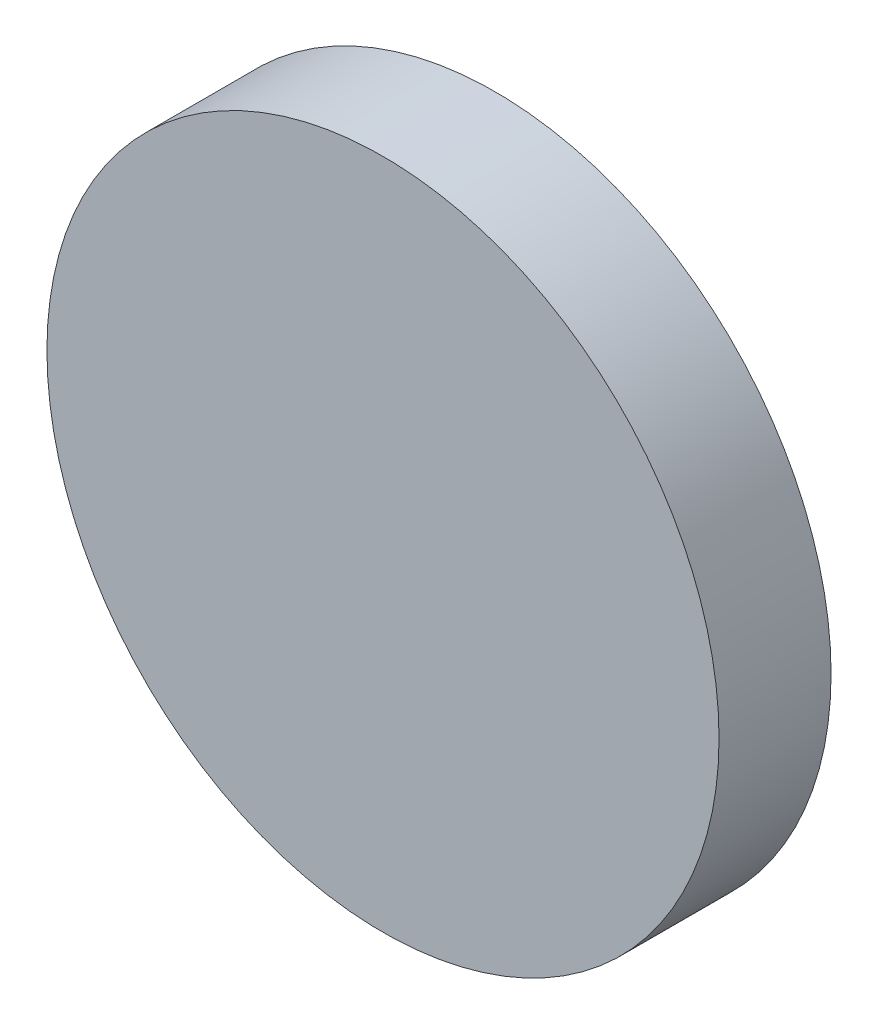
ISO-10303-21;
HEADER;
FILE_DESCRIPTION(('STEP AP214'),'2;1');
FILE_NAME('part.step','',(''),(''),'','','');
FILE_SCHEMA(('AUTOMOTIVE_DESIGN { 1 0 10303 214 1 1 1 1 }'));
ENDSEC;
DATA;
#1=APPLICATION_CONTEXT('core data for automotive mechanical design processes');
#2=APPLICATION_PROTOCOL_DEFINITION('international standard','automotive_design',2000,#1);
#3=PRODUCT_CONTEXT('',#1,'mechanical');
#4=PRODUCT('Part','Part','',(#3));
#5=PRODUCT_RELATED_PRODUCT_CATEGORY('part','',(#4));
#6=PRODUCT_DEFINITION_FORMATION('','',#4);
#7=PRODUCT_DEFINITION_CONTEXT('part definition',#1,'design');
#8=PRODUCT_DEFINITION('design','',#6,#7);
#9=PRODUCT_DEFINITION_SHAPE('','',#8);
#10=(LENGTH_UNIT() NAMED_UNIT(*) SI_UNIT(.MILLI.,.METRE.));
#11=(NAMED_UNIT(*) PLANE_ANGLE_UNIT() SI_UNIT($,.RADIAN.));
#12=(NAMED_UNIT(*) SI_UNIT($,.STERADIAN.) SOLID_ANGLE_UNIT());
#13=UNCERTAINTY_MEASURE_WITH_UNIT(LENGTH_MEASURE(1.E-05),#10,'distance_accuracy_value','');
#14=(GEOMETRIC_REPRESENTATION_CONTEXT(3) GLOBAL_UNCERTAINTY_ASSIGNED_CONTEXT((#13)) GLOBAL_UNIT_ASSIGNED_CONTEXT((#10,
#11,#12)) REPRESENTATION_CONTEXT('',''));
#15=CARTESIAN_POINT('',(0.,0.,0.));
#16=DIRECTION('',(0.,0.,1.));
#17=DIRECTION('',(1.,0.,0.));
#18=AXIS2_PLACEMENT_3D('',#15,#16,#17);
#19=CARTESIAN_POINT('',(0.,0.,6.35));
#20=DIRECTION('',(0.,0.,-1.));
#21=DIRECTION('',(-1.,0.,0.));
#22=AXIS2_PLACEMENT_3D('',#19,#20,#21);
#23=CYLINDRICAL_SURFACE('',#22,19.05);
#24=CARTESIAN_POINT('',(0.,0.,6.35));
#25=DIRECTION('',(0.,0.,1.));
#26=DIRECTION('',(1.,0.,0.));
#27=AXIS2_PLACEMENT_3D('',#24,#25,#26);
#28=CIRCLE('',#27,19.05);
#29=CARTESIAN_POINT('',(19.05,0.,6.35));
#30=VERTEX_POINT('',#29);
#31=EDGE_CURVE('E10',#30,#30,#28,.T.);
#32=ORIENTED_EDGE('',*,*,#31,.F.);
#33=EDGE_LOOP('',(#32));
#34=FACE_BOUND('',#33,.T.);
#35=CARTESIAN_POINT('',(0.,0.,0.));
#36=DIRECTION('',(0.,0.,1.));
#37=DIRECTION('',(1.,0.,0.));
#38=AXIS2_PLACEMENT_3D('',#35,#36,#37);
#39=CIRCLE('',#38,19.05);
#40=CARTESIAN_POINT('',(19.05,0.,0.));
#41=VERTEX_POINT('',#40);
#42=EDGE_CURVE('E38',#41,#41,#39,.T.);
#43=ORIENTED_EDGE('',*,*,#42,.T.);
#44=EDGE_LOOP('',(#43));
#45=FACE_BOUND('',#44,.T.);
#46=ADVANCED_FACE('F35',(#34,#45),#23,.T.);
#47=CARTESIAN_POINT('',(0.,0.,6.35));
#48=DIRECTION('',(0.,0.,1.));
#49=DIRECTION('',(1.,0.,0.));
#50=AXIS2_PLACEMENT_3D('',#47,#48,#49);
#51=PLANE('',#50);
#52=ORIENTED_EDGE('',*,*,#31,.T.);
#53=EDGE_LOOP('',(#52));
#54=FACE_BOUND('',#53,.T.);
#55=ADVANCED_FACE('F50',(#54),#51,.T.);
#56=CARTESIAN_POINT('',(0.,0.,0.));
#57=DIRECTION('',(0.,0.,1.));
#58=DIRECTION('',(1.,0.,0.));
#59=AXIS2_PLACEMENT_3D('',#56,#57,#58);
#60=PLANE('',#59);
#61=ORIENTED_EDGE('',*,*,#42,.F.);
#62=EDGE_LOOP('',(#61));
#63=FACE_BOUND('',#62,.T.);
#64=ADVANCED_FACE('F48',(#63),#60,.F.);
#65=CLOSED_SHELL('',(#46,#55,#64));
#66=MANIFOLD_SOLID_BREP('B2',#65);
#67=ADVANCED_BREP_SHAPE_REPRESENTATION('',(#18,#66),#14);
#68=SHAPE_DEFINITION_REPRESENTATION(#9,#67);
ENDSEC;
END-ISO-10303-21;
